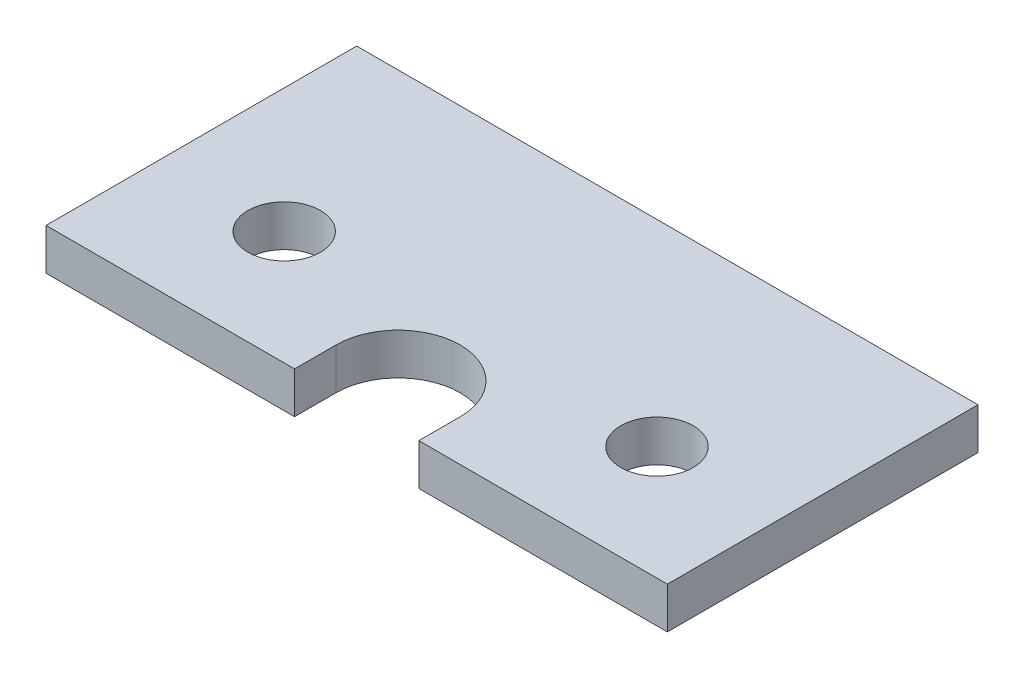
ISO-10303-21;
HEADER;
FILE_DESCRIPTION(('STEP AP214'),'2;1');
FILE_NAME('part.step','',(''),(''),'','','');
FILE_SCHEMA(('AUTOMOTIVE_DESIGN { 1 0 10303 214 1 1 1 1 }'));
ENDSEC;
DATA;
#1=APPLICATION_CONTEXT('core data for automotive mechanical design processes');
#2=APPLICATION_PROTOCOL_DEFINITION('international standard','automotive_design',2000,#1);
#3=PRODUCT_CONTEXT('',#1,'mechanical');
#4=PRODUCT('Part','Part','',(#3));
#5=PRODUCT_RELATED_PRODUCT_CATEGORY('part','',(#4));
#6=PRODUCT_DEFINITION_FORMATION('','',#4);
#7=PRODUCT_DEFINITION_CONTEXT('part definition',#1,'design');
#8=PRODUCT_DEFINITION('design','',#6,#7);
#9=PRODUCT_DEFINITION_SHAPE('','',#8);
#10=(LENGTH_UNIT() NAMED_UNIT(*) SI_UNIT(.MILLI.,.METRE.));
#11=(NAMED_UNIT(*) PLANE_ANGLE_UNIT() SI_UNIT($,.RADIAN.));
#12=(NAMED_UNIT(*) SI_UNIT($,.STERADIAN.) SOLID_ANGLE_UNIT());
#13=UNCERTAINTY_MEASURE_WITH_UNIT(LENGTH_MEASURE(1.E-05),#10,'distance_accuracy_value','');
#14=(GEOMETRIC_REPRESENTATION_CONTEXT(3) GLOBAL_UNCERTAINTY_ASSIGNED_CONTEXT((#13)) GLOBAL_UNIT_ASSIGNED_CONTEXT((#10,
#11,#12)) REPRESENTATION_CONTEXT('',''));
#15=CARTESIAN_POINT('',(0.,0.,0.));
#16=DIRECTION('',(0.,0.,1.));
#17=DIRECTION('',(1.,0.,0.));
#18=AXIS2_PLACEMENT_3D('',#15,#16,#17);
#19=CARTESIAN_POINT('',(15.,2.,-1.99999999999999));
#20=DIRECTION('',(0.,1.,0.));
#21=DIRECTION('',(0.,0.,1.));
#22=AXIS2_PLACEMENT_3D('',#19,#20,#21);
#23=PLANE('',#22);
#24=CARTESIAN_POINT('',(24.,2.,-5.5));
#25=DIRECTION('',(0.,1.,0.));
#26=DIRECTION('',(0.,0.,1.));
#27=AXIS2_PLACEMENT_3D('',#24,#25,#26);
#28=CIRCLE('',#27,1.75);
#29=CARTESIAN_POINT('',(24.,2.,-3.75));
#30=VERTEX_POINT('',#29);
#31=EDGE_CURVE('E134',#30,#30,#28,.T.);
#32=ORIENTED_EDGE('',*,*,#31,.F.);
#33=EDGE_LOOP('',(#32));
#34=FACE_BOUND('',#33,.T.);
#35=DIRECTION('',(0.,0.,1.));
#36=VECTOR('',#35,1.);
#37=CARTESIAN_POINT('',(0.,2.,0.));
#38=LINE('',#37,#36);
#39=CARTESIAN_POINT('',(0.,2.,-15.));
#40=VERTEX_POINT('',#39);
#41=CARTESIAN_POINT('',(0.,2.,0.));
#42=VERTEX_POINT('',#41);
#43=EDGE_CURVE('E145',#40,#42,#38,.T.);
#44=ORIENTED_EDGE('',*,*,#43,.T.);
#45=DIRECTION('',(1.,0.,0.));
#46=VECTOR('',#45,1.);
#47=CARTESIAN_POINT('',(0.,2.,0.));
#48=LINE('',#47,#46);
#49=CARTESIAN_POINT('',(12.,2.,0.));
#50=VERTEX_POINT('',#49);
#51=EDGE_CURVE('E93',#42,#50,#48,.T.);
#52=ORIENTED_EDGE('',*,*,#51,.T.);
#53=DIRECTION('',(0.,0.,-1.));
#54=VECTOR('',#53,1.);
#55=CARTESIAN_POINT('',(12.,2.,-1.99999999999999));
#56=LINE('',#55,#54);
#57=CARTESIAN_POINT('',(12.,2.,-1.99999999999999));
#58=VERTEX_POINT('',#57);
#59=EDGE_CURVE('E160',#50,#58,#56,.T.);
#60=ORIENTED_EDGE('',*,*,#59,.T.);
#61=CARTESIAN_POINT('',(15.,2.,-1.99999999999999));
#62=DIRECTION('',(0.,-1.,0.));
#63=DIRECTION('',(0.,0.,1.));
#64=AXIS2_PLACEMENT_3D('',#61,#62,#63);
#65=CIRCLE('',#64,3.);
#66=CARTESIAN_POINT('',(18.,2.,-2.));
#67=VERTEX_POINT('',#66);
#68=EDGE_CURVE('E173',#58,#67,#65,.T.);
#69=ORIENTED_EDGE('',*,*,#68,.T.);
#70=DIRECTION('',(0.,0.,1.));
#71=VECTOR('',#70,1.);
#72=CARTESIAN_POINT('',(18.,2.,-2.));
#73=LINE('',#72,#71);
#74=CARTESIAN_POINT('',(18.,2.,0.));
#75=VERTEX_POINT('',#74);
#76=EDGE_CURVE('E112',#67,#75,#73,.T.);
#77=ORIENTED_EDGE('',*,*,#76,.T.);
#78=DIRECTION('',(1.,0.,0.));
#79=VECTOR('',#78,1.);
#80=CARTESIAN_POINT('',(18.,2.,0.));
#81=LINE('',#80,#79);
#82=CARTESIAN_POINT('',(30.,2.,0.));
#83=VERTEX_POINT('',#82);
#84=EDGE_CURVE('E106',#75,#83,#81,.T.);
#85=ORIENTED_EDGE('',*,*,#84,.T.);
#86=DIRECTION('',(0.,0.,-1.));
#87=VECTOR('',#86,1.);
#88=CARTESIAN_POINT('',(30.,2.,0.));
#89=LINE('',#88,#87);
#90=CARTESIAN_POINT('',(30.,2.,-15.));
#91=VERTEX_POINT('',#90);
#92=EDGE_CURVE('E110',#83,#91,#89,.T.);
#93=ORIENTED_EDGE('',*,*,#92,.T.);
#94=DIRECTION('',(-1.,0.,0.));
#95=VECTOR('',#94,1.);
#96=CARTESIAN_POINT('',(0.,2.,-15.));
#97=LINE('',#96,#95);
#98=EDGE_CURVE('E50',#91,#40,#97,.T.);
#99=ORIENTED_EDGE('',*,*,#98,.T.);
#100=EDGE_LOOP('',(#44,#52,#60,#69,#77,#85,#93,#99));
#101=FACE_BOUND('',#100,.T.);
#102=CARTESIAN_POINT('',(6.,2.,-5.5));
#103=DIRECTION('',(0.,1.,0.));
#104=DIRECTION('',(0.,0.,1.));
#105=AXIS2_PLACEMENT_3D('',#102,#103,#104);
#106=CIRCLE('',#105,1.75);
#107=CARTESIAN_POINT('',(6.,2.,-3.75));
#108=VERTEX_POINT('',#107);
#109=EDGE_CURVE('E182',#108,#108,#106,.T.);
#110=ORIENTED_EDGE('',*,*,#109,.F.);
#111=EDGE_LOOP('',(#110));
#112=FACE_BOUND('',#111,.T.);
#113=ADVANCED_FACE('F33',(#34,#101,#112),#23,.T.);
#114=CARTESIAN_POINT('',(15.,0.,-1.99999999999999));
#115=DIRECTION('',(0.,1.,0.));
#116=DIRECTION('',(0.,0.,1.));
#117=AXIS2_PLACEMENT_3D('',#114,#115,#116);
#118=PLANE('',#117);
#119=CARTESIAN_POINT('',(24.,0.,-5.5));
#120=DIRECTION('',(0.,1.,0.));
#121=DIRECTION('',(0.,0.,1.));
#122=AXIS2_PLACEMENT_3D('',#119,#120,#121);
#123=CIRCLE('',#122,1.75);
#124=CARTESIAN_POINT('',(24.,0.,-3.75));
#125=VERTEX_POINT('',#124);
#126=EDGE_CURVE('E179',#125,#125,#123,.T.);
#127=ORIENTED_EDGE('',*,*,#126,.T.);
#128=EDGE_LOOP('',(#127));
#129=FACE_BOUND('',#128,.T.);
#130=DIRECTION('',(0.,0.,1.));
#131=VECTOR('',#130,1.);
#132=CARTESIAN_POINT('',(0.,0.,0.));
#133=LINE('',#132,#131);
#134=CARTESIAN_POINT('',(0.,0.,-15.));
#135=VERTEX_POINT('',#134);
#136=CARTESIAN_POINT('',(0.,0.,0.));
#137=VERTEX_POINT('',#136);
#138=EDGE_CURVE('E130',#135,#137,#133,.T.);
#139=ORIENTED_EDGE('',*,*,#138,.F.);
#140=DIRECTION('',(-1.,0.,0.));
#141=VECTOR('',#140,1.);
#142=CARTESIAN_POINT('',(0.,0.,-15.));
#143=LINE('',#142,#141);
#144=CARTESIAN_POINT('',(30.,0.,-15.));
#145=VERTEX_POINT('',#144);
#146=EDGE_CURVE('E85',#145,#135,#143,.T.);
#147=ORIENTED_EDGE('',*,*,#146,.F.);
#148=DIRECTION('',(0.,0.,-1.));
#149=VECTOR('',#148,1.);
#150=CARTESIAN_POINT('',(30.,0.,0.));
#151=LINE('',#150,#149);
#152=CARTESIAN_POINT('',(30.,0.,0.));
#153=VERTEX_POINT('',#152);
#154=EDGE_CURVE('E79',#153,#145,#151,.T.);
#155=ORIENTED_EDGE('',*,*,#154,.F.);
#156=DIRECTION('',(1.,0.,0.));
#157=VECTOR('',#156,1.);
#158=CARTESIAN_POINT('',(18.,0.,0.));
#159=LINE('',#158,#157);
#160=CARTESIAN_POINT('',(18.,0.,0.));
#161=VERTEX_POINT('',#160);
#162=EDGE_CURVE('E120',#161,#153,#159,.T.);
#163=ORIENTED_EDGE('',*,*,#162,.F.);
#164=DIRECTION('',(0.,0.,1.));
#165=VECTOR('',#164,1.);
#166=CARTESIAN_POINT('',(18.,0.,-2.));
#167=LINE('',#166,#165);
#168=CARTESIAN_POINT('',(18.,0.,-2.));
#169=VERTEX_POINT('',#168);
#170=EDGE_CURVE('E140',#169,#161,#167,.T.);
#171=ORIENTED_EDGE('',*,*,#170,.F.);
#172=CARTESIAN_POINT('',(15.,0.,-1.99999999999999));
#173=DIRECTION('',(0.,-1.,0.));
#174=DIRECTION('',(0.,0.,1.));
#175=AXIS2_PLACEMENT_3D('',#172,#173,#174);
#176=CIRCLE('',#175,3.);
#177=CARTESIAN_POINT('',(12.,0.,-1.99999999999999));
#178=VERTEX_POINT('',#177);
#179=EDGE_CURVE('E138',#178,#169,#176,.T.);
#180=ORIENTED_EDGE('',*,*,#179,.F.);
#181=DIRECTION('',(0.,0.,-1.));
#182=VECTOR('',#181,1.);
#183=CARTESIAN_POINT('',(12.,0.,-1.99999999999999));
#184=LINE('',#183,#182);
#185=CARTESIAN_POINT('',(12.,0.,0.));
#186=VERTEX_POINT('',#185);
#187=EDGE_CURVE('E136',#186,#178,#184,.T.);
#188=ORIENTED_EDGE('',*,*,#187,.F.);
#189=DIRECTION('',(1.,0.,0.));
#190=VECTOR('',#189,1.);
#191=CARTESIAN_POINT('',(0.,0.,0.));
#192=LINE('',#191,#190);
#193=EDGE_CURVE('E133',#137,#186,#192,.T.);
#194=ORIENTED_EDGE('',*,*,#193,.F.);
#195=EDGE_LOOP('',(#139,#147,#155,#163,#171,#180,#188,#194));
#196=FACE_BOUND('',#195,.T.);
#197=CARTESIAN_POINT('',(6.,0.,-5.5));
#198=DIRECTION('',(0.,1.,0.));
#199=DIRECTION('',(0.,0.,1.));
#200=AXIS2_PLACEMENT_3D('',#197,#198,#199);
#201=CIRCLE('',#200,1.75);
#202=CARTESIAN_POINT('',(6.,0.,-3.75));
#203=VERTEX_POINT('',#202);
#204=EDGE_CURVE('E185',#203,#203,#201,.T.);
#205=ORIENTED_EDGE('',*,*,#204,.T.);
#206=EDGE_LOOP('',(#205));
#207=FACE_BOUND('',#206,.T.);
#208=ADVANCED_FACE('F164',(#129,#196,#207),#118,.F.);
#209=CARTESIAN_POINT('',(0.,2.,0.));
#210=DIRECTION('',(1.,0.,0.));
#211=DIRECTION('',(0.,0.,-1.));
#212=AXIS2_PLACEMENT_3D('',#209,#210,#211);
#213=PLANE('',#212);
#214=ORIENTED_EDGE('',*,*,#138,.T.);
#215=DIRECTION('',(0.,-1.,0.));
#216=VECTOR('',#215,1.);
#217=CARTESIAN_POINT('',(0.,2.,0.));
#218=LINE('',#217,#216);
#219=EDGE_CURVE('E11',#42,#137,#218,.T.);
#220=ORIENTED_EDGE('',*,*,#219,.F.);
#221=ORIENTED_EDGE('',*,*,#43,.F.);
#222=DIRECTION('',(0.,-1.,0.));
#223=VECTOR('',#222,1.);
#224=CARTESIAN_POINT('',(0.,2.,-15.));
#225=LINE('',#224,#223);
#226=EDGE_CURVE('E126',#40,#135,#225,.T.);
#227=ORIENTED_EDGE('',*,*,#226,.T.);
#228=EDGE_LOOP('',(#214,#220,#221,#227));
#229=FACE_BOUND('',#228,.T.);
#230=ADVANCED_FACE('F35',(#229),#213,.F.);
#231=CARTESIAN_POINT('',(0.,2.,0.));
#232=DIRECTION('',(0.,0.,-1.));
#233=DIRECTION('',(-1.,0.,0.));
#234=AXIS2_PLACEMENT_3D('',#231,#232,#233);
#235=PLANE('',#234);
#236=ORIENTED_EDGE('',*,*,#193,.T.);
#237=DIRECTION('',(0.,-1.,0.));
#238=VECTOR('',#237,1.);
#239=CARTESIAN_POINT('',(12.,2.,0.));
#240=LINE('',#239,#238);
#241=EDGE_CURVE('E42',#50,#186,#240,.T.);
#242=ORIENTED_EDGE('',*,*,#241,.F.);
#243=ORIENTED_EDGE('',*,*,#51,.F.);
#244=ORIENTED_EDGE('',*,*,#219,.T.);
#245=EDGE_LOOP('',(#236,#242,#243,#244));
#246=FACE_BOUND('',#245,.T.);
#247=ADVANCED_FACE('F218',(#246),#235,.F.);
#248=CARTESIAN_POINT('',(12.,2.,-1.99999999999999));
#249=DIRECTION('',(-1.,0.,0.));
#250=DIRECTION('',(0.,0.,1.));
#251=AXIS2_PLACEMENT_3D('',#248,#249,#250);
#252=PLANE('',#251);
#253=ORIENTED_EDGE('',*,*,#187,.T.);
#254=DIRECTION('',(0.,-1.,0.));
#255=VECTOR('',#254,1.);
#256=CARTESIAN_POINT('',(12.,2.,-1.99999999999999));
#257=LINE('',#256,#255);
#258=EDGE_CURVE('E152',#58,#178,#257,.T.);
#259=ORIENTED_EDGE('',*,*,#258,.F.);
#260=ORIENTED_EDGE('',*,*,#59,.F.);
#261=ORIENTED_EDGE('',*,*,#241,.T.);
#262=EDGE_LOOP('',(#253,#259,#260,#261));
#263=FACE_BOUND('',#262,.T.);
#264=ADVANCED_FACE('F158',(#263),#252,.F.);
#265=CARTESIAN_POINT('',(15.,2.,-1.99999999999999));
#266=DIRECTION('',(0.,-1.,0.));
#267=DIRECTION('',(0.,0.,-1.));
#268=AXIS2_PLACEMENT_3D('',#265,#266,#267);
#269=CYLINDRICAL_SURFACE('',#268,3.);
#270=ORIENTED_EDGE('',*,*,#179,.T.);
#271=DIRECTION('',(0.,-1.,0.));
#272=VECTOR('',#271,1.);
#273=CARTESIAN_POINT('',(18.,2.,-2.));
#274=LINE('',#273,#272);
#275=EDGE_CURVE('E149',#67,#169,#274,.T.);
#276=ORIENTED_EDGE('',*,*,#275,.F.);
#277=ORIENTED_EDGE('',*,*,#68,.F.);
#278=ORIENTED_EDGE('',*,*,#258,.T.);
#279=EDGE_LOOP('',(#270,#276,#277,#278));
#280=FACE_BOUND('',#279,.T.);
#281=ADVANCED_FACE('F169',(#280),#269,.F.);
#282=CARTESIAN_POINT('',(18.,2.,-2.));
#283=DIRECTION('',(1.,0.,0.));
#284=DIRECTION('',(0.,0.,-1.));
#285=AXIS2_PLACEMENT_3D('',#282,#283,#284);
#286=PLANE('',#285);
#287=ORIENTED_EDGE('',*,*,#170,.T.);
#288=DIRECTION('',(0.,-1.,0.));
#289=VECTOR('',#288,1.);
#290=CARTESIAN_POINT('',(18.,2.,0.));
#291=LINE('',#290,#289);
#292=EDGE_CURVE('E121',#75,#161,#291,.T.);
#293=ORIENTED_EDGE('',*,*,#292,.F.);
#294=ORIENTED_EDGE('',*,*,#76,.F.);
#295=ORIENTED_EDGE('',*,*,#275,.T.);
#296=EDGE_LOOP('',(#287,#293,#294,#295));
#297=FACE_BOUND('',#296,.T.);
#298=ADVANCED_FACE('F172',(#297),#286,.F.);
#299=CARTESIAN_POINT('',(18.,2.,0.));
#300=DIRECTION('',(0.,0.,-1.));
#301=DIRECTION('',(-1.,0.,0.));
#302=AXIS2_PLACEMENT_3D('',#299,#300,#301);
#303=PLANE('',#302);
#304=ORIENTED_EDGE('',*,*,#162,.T.);
#305=DIRECTION('',(0.,-1.,0.));
#306=VECTOR('',#305,1.);
#307=CARTESIAN_POINT('',(30.,2.,0.));
#308=LINE('',#307,#306);
#309=EDGE_CURVE('E117',#83,#153,#308,.T.);
#310=ORIENTED_EDGE('',*,*,#309,.F.);
#311=ORIENTED_EDGE('',*,*,#84,.F.);
#312=ORIENTED_EDGE('',*,*,#292,.T.);
#313=EDGE_LOOP('',(#304,#310,#311,#312));
#314=FACE_BOUND('',#313,.T.);
#315=ADVANCED_FACE('F118',(#314),#303,.F.);
#316=CARTESIAN_POINT('',(30.,2.,0.));
#317=DIRECTION('',(-1.,0.,0.));
#318=DIRECTION('',(0.,0.,1.));
#319=AXIS2_PLACEMENT_3D('',#316,#317,#318);
#320=PLANE('',#319);
#321=ORIENTED_EDGE('',*,*,#154,.T.);
#322=DIRECTION('',(0.,-1.,0.));
#323=VECTOR('',#322,1.);
#324=CARTESIAN_POINT('',(30.,2.,-15.));
#325=LINE('',#324,#323);
#326=EDGE_CURVE('E122',#91,#145,#325,.T.);
#327=ORIENTED_EDGE('',*,*,#326,.F.);
#328=ORIENTED_EDGE('',*,*,#92,.F.);
#329=ORIENTED_EDGE('',*,*,#309,.T.);
#330=EDGE_LOOP('',(#321,#327,#328,#329));
#331=FACE_BOUND('',#330,.T.);
#332=ADVANCED_FACE('F124',(#331),#320,.F.);
#333=CARTESIAN_POINT('',(0.,2.,-15.));
#334=DIRECTION('',(0.,0.,1.));
#335=DIRECTION('',(1.,0.,0.));
#336=AXIS2_PLACEMENT_3D('',#333,#334,#335);
#337=PLANE('',#336);
#338=ORIENTED_EDGE('',*,*,#146,.T.);
#339=ORIENTED_EDGE('',*,*,#226,.F.);
#340=ORIENTED_EDGE('',*,*,#98,.F.);
#341=ORIENTED_EDGE('',*,*,#326,.T.);
#342=EDGE_LOOP('',(#338,#339,#340,#341));
#343=FACE_BOUND('',#342,.T.);
#344=ADVANCED_FACE('F206',(#343),#337,.F.);
#345=CARTESIAN_POINT('',(24.,2.,-5.5));
#346=DIRECTION('',(0.,-1.,0.));
#347=DIRECTION('',(0.,0.,-1.));
#348=AXIS2_PLACEMENT_3D('',#345,#346,#347);
#349=CYLINDRICAL_SURFACE('',#348,1.75);
#350=ORIENTED_EDGE('',*,*,#31,.T.);
#351=EDGE_LOOP('',(#350));
#352=FACE_BOUND('',#351,.T.);
#353=ORIENTED_EDGE('',*,*,#126,.F.);
#354=EDGE_LOOP('',(#353));
#355=FACE_BOUND('',#354,.T.);
#356=ADVANCED_FACE('F203',(#352,#355),#349,.F.);
#357=CARTESIAN_POINT('',(6.,2.,-5.5));
#358=DIRECTION('',(0.,-1.,0.));
#359=DIRECTION('',(0.,0.,-1.));
#360=AXIS2_PLACEMENT_3D('',#357,#358,#359);
#361=CYLINDRICAL_SURFACE('',#360,1.75);
#362=ORIENTED_EDGE('',*,*,#109,.T.);
#363=EDGE_LOOP('',(#362));
#364=FACE_BOUND('',#363,.T.);
#365=ORIENTED_EDGE('',*,*,#204,.F.);
#366=EDGE_LOOP('',(#365));
#367=FACE_BOUND('',#366,.T.);
#368=ADVANCED_FACE('F191',(#364,#367),#361,.F.);
#369=CLOSED_SHELL('',(#113,#208,#230,#247,#264,#281,#298,#315,#332,#344,#356,#368));
#370=MANIFOLD_SOLID_BREP('B2',#369);
#371=ADVANCED_BREP_SHAPE_REPRESENTATION('',(#18,#370),#14);
#372=SHAPE_DEFINITION_REPRESENTATION(#9,#371);
ENDSEC;
END-ISO-10303-21;
